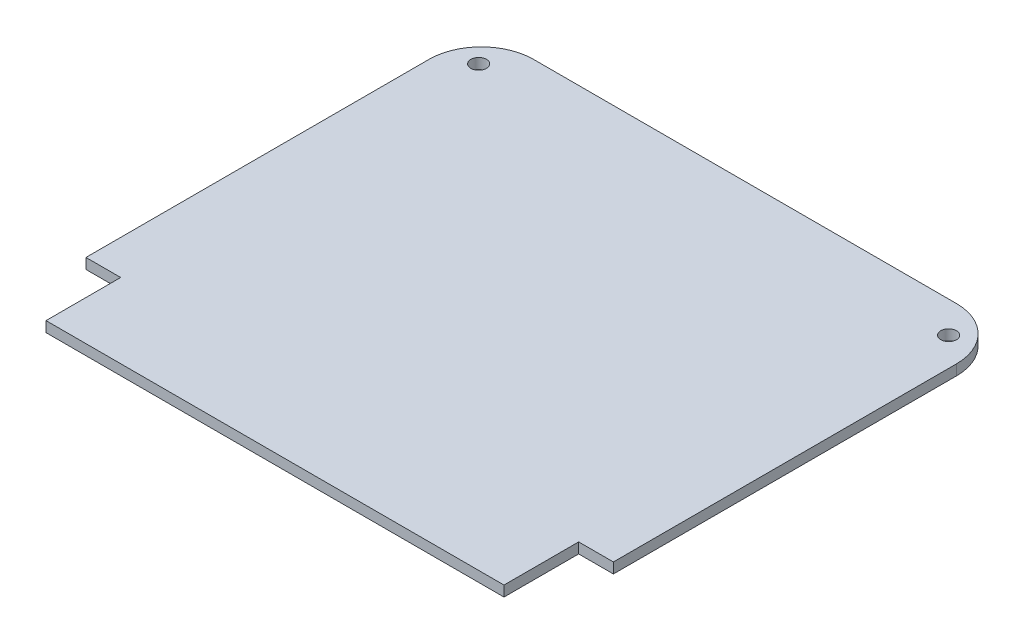
ISO-10303-21;
HEADER;
FILE_DESCRIPTION(('STEP AP214'),'2;1');
FILE_NAME('part.step','',(''),(''),'','','');
FILE_SCHEMA(('AUTOMOTIVE_DESIGN { 1 0 10303 214 1 1 1 1 }'));
ENDSEC;
DATA;
#1=APPLICATION_CONTEXT('core data for automotive mechanical design processes');
#2=APPLICATION_PROTOCOL_DEFINITION('international standard','automotive_design',2000,#1);
#3=PRODUCT_CONTEXT('',#1,'mechanical');
#4=PRODUCT('Part','Part','',(#3));
#5=PRODUCT_RELATED_PRODUCT_CATEGORY('part','',(#4));
#6=PRODUCT_DEFINITION_FORMATION('','',#4);
#7=PRODUCT_DEFINITION_CONTEXT('part definition',#1,'design');
#8=PRODUCT_DEFINITION('design','',#6,#7);
#9=PRODUCT_DEFINITION_SHAPE('','',#8);
#10=(LENGTH_UNIT() NAMED_UNIT(*) SI_UNIT(.MILLI.,.METRE.));
#11=(NAMED_UNIT(*) PLANE_ANGLE_UNIT() SI_UNIT($,.RADIAN.));
#12=(NAMED_UNIT(*) SI_UNIT($,.STERADIAN.) SOLID_ANGLE_UNIT());
#13=UNCERTAINTY_MEASURE_WITH_UNIT(LENGTH_MEASURE(1.E-05),#10,'distance_accuracy_value','');
#14=(GEOMETRIC_REPRESENTATION_CONTEXT(3) GLOBAL_UNCERTAINTY_ASSIGNED_CONTEXT((#13)) GLOBAL_UNIT_ASSIGNED_CONTEXT((#10,
#11,#12)) REPRESENTATION_CONTEXT('',''));
#15=CARTESIAN_POINT('',(0.,0.,0.));
#16=DIRECTION('',(0.,0.,1.));
#17=DIRECTION('',(1.,0.,0.));
#18=AXIS2_PLACEMENT_3D('',#15,#16,#17);
#19=CARTESIAN_POINT('',(-87.7,2.,100.302122975735));
#20=DIRECTION('',(0.,0.,-1.));
#21=DIRECTION('',(-1.,0.,0.));
#22=AXIS2_PLACEMENT_3D('',#19,#20,#21);
#23=PLANE('',#22);
#24=DIRECTION('',(1.,0.,0.));
#25=VECTOR('',#24,1.);
#26=CARTESIAN_POINT('',(-87.7,0.,100.302122975735));
#27=LINE('',#26,#25);
#28=CARTESIAN_POINT('',(-87.7,0.,100.302122975735));
#29=VERTEX_POINT('',#28);
#30=CARTESIAN_POINT('',(0.,0.,100.302122975735));
#31=VERTEX_POINT('',#30);
#32=EDGE_CURVE('E144',#29,#31,#27,.T.);
#33=ORIENTED_EDGE('',*,*,#32,.T.);
#34=DIRECTION('',(0.,-1.,0.));
#35=VECTOR('',#34,1.);
#36=CARTESIAN_POINT('',(0.,2.,100.302122975735));
#37=LINE('',#36,#35);
#38=CARTESIAN_POINT('',(0.,2.,100.302122975735));
#39=VERTEX_POINT('',#38);
#40=EDGE_CURVE('E11',#39,#31,#37,.T.);
#41=ORIENTED_EDGE('',*,*,#40,.F.);
#42=DIRECTION('',(1.,0.,0.));
#43=VECTOR('',#42,1.);
#44=CARTESIAN_POINT('',(-87.7,2.,100.302122975735));
#45=LINE('',#44,#43);
#46=CARTESIAN_POINT('',(-87.7,2.,100.302122975735));
#47=VERTEX_POINT('',#46);
#48=EDGE_CURVE('E163',#47,#39,#45,.T.);
#49=ORIENTED_EDGE('',*,*,#48,.F.);
#50=DIRECTION('',(0.,-1.,0.));
#51=VECTOR('',#50,1.);
#52=CARTESIAN_POINT('',(-87.7,2.,100.302122975735));
#53=LINE('',#52,#51);
#54=EDGE_CURVE('E140',#47,#29,#53,.T.);
#55=ORIENTED_EDGE('',*,*,#54,.T.);
#56=EDGE_LOOP('',(#33,#41,#49,#55));
#57=FACE_BOUND('',#56,.T.);
#58=ADVANCED_FACE('F34',(#57),#23,.F.);
#59=CARTESIAN_POINT('',(0.,2.,100.302122975735));
#60=DIRECTION('',(-1.,0.,0.));
#61=DIRECTION('',(0.,0.,1.));
#62=AXIS2_PLACEMENT_3D('',#59,#60,#61);
#63=PLANE('',#62);
#64=DIRECTION('',(0.,0.,-1.));
#65=VECTOR('',#64,1.);
#66=CARTESIAN_POINT('',(0.,0.,100.302122975735));
#67=LINE('',#66,#65);
#68=CARTESIAN_POINT('',(0.,0.,86.0021229757346));
#69=VERTEX_POINT('',#68);
#70=EDGE_CURVE('E147',#31,#69,#67,.T.);
#71=ORIENTED_EDGE('',*,*,#70,.T.);
#72=DIRECTION('',(0.,-1.,0.));
#73=VECTOR('',#72,1.);
#74=CARTESIAN_POINT('',(0.,2.,86.0021229757346));
#75=LINE('',#74,#73);
#76=CARTESIAN_POINT('',(0.,2.,86.0021229757346));
#77=VERTEX_POINT('',#76);
#78=EDGE_CURVE('E43',#77,#69,#75,.T.);
#79=ORIENTED_EDGE('',*,*,#78,.F.);
#80=DIRECTION('',(0.,0.,-1.));
#81=VECTOR('',#80,1.);
#82=CARTESIAN_POINT('',(0.,2.,100.302122975735));
#83=LINE('',#82,#81);
#84=EDGE_CURVE('E101',#39,#77,#83,.T.);
#85=ORIENTED_EDGE('',*,*,#84,.F.);
#86=ORIENTED_EDGE('',*,*,#40,.T.);
#87=EDGE_LOOP('',(#71,#79,#85,#86));
#88=FACE_BOUND('',#87,.T.);
#89=ADVANCED_FACE('F230',(#88),#63,.F.);
#90=CARTESIAN_POINT('',(0.,2.,86.0021229757346));
#91=DIRECTION('',(0.,0.,-1.));
#92=DIRECTION('',(-1.,0.,0.));
#93=AXIS2_PLACEMENT_3D('',#90,#91,#92);
#94=PLANE('',#93);
#95=DIRECTION('',(1.,0.,0.));
#96=VECTOR('',#95,1.);
#97=CARTESIAN_POINT('',(0.,0.,86.0021229757346));
#98=LINE('',#97,#96);
#99=CARTESIAN_POINT('',(6.64999999999999,0.,86.0021229757346));
#100=VERTEX_POINT('',#99);
#101=EDGE_CURVE('E150',#69,#100,#98,.T.);
#102=ORIENTED_EDGE('',*,*,#101,.T.);
#103=DIRECTION('',(0.,-1.,0.));
#104=VECTOR('',#103,1.);
#105=CARTESIAN_POINT('',(6.64999999999999,2.,86.0021229757346));
#106=LINE('',#105,#104);
#107=CARTESIAN_POINT('',(6.64999999999999,2.,86.0021229757346));
#108=VERTEX_POINT('',#107);
#109=EDGE_CURVE('E176',#108,#100,#106,.T.);
#110=ORIENTED_EDGE('',*,*,#109,.F.);
#111=DIRECTION('',(1.,0.,0.));
#112=VECTOR('',#111,1.);
#113=CARTESIAN_POINT('',(0.,2.,86.0021229757346));
#114=LINE('',#113,#112);
#115=EDGE_CURVE('E194',#77,#108,#114,.T.);
#116=ORIENTED_EDGE('',*,*,#115,.F.);
#117=ORIENTED_EDGE('',*,*,#78,.T.);
#118=EDGE_LOOP('',(#102,#110,#116,#117));
#119=FACE_BOUND('',#118,.T.);
#120=ADVANCED_FACE('F234',(#119),#94,.F.);
#121=CARTESIAN_POINT('',(6.64999999999999,2.,86.0021229757346));
#122=DIRECTION('',(-1.,0.,0.));
#123=DIRECTION('',(0.,0.,1.));
#124=AXIS2_PLACEMENT_3D('',#121,#122,#123);
#125=PLANE('',#124);
#126=DIRECTION('',(0.,0.,-1.));
#127=VECTOR('',#126,1.);
#128=CARTESIAN_POINT('',(6.64999999999999,0.,86.0021229757346));
#129=LINE('',#128,#127);
#130=CARTESIAN_POINT('',(6.65,0.,20.3021229757347));
#131=VERTEX_POINT('',#130);
#132=EDGE_CURVE('E152',#100,#131,#129,.T.);
#133=ORIENTED_EDGE('',*,*,#132,.T.);
#134=DIRECTION('',(0.,-1.,0.));
#135=VECTOR('',#134,1.);
#136=CARTESIAN_POINT('',(6.65,2.,20.3021229757347));
#137=LINE('',#136,#135);
#138=CARTESIAN_POINT('',(6.65,2.,20.3021229757347));
#139=VERTEX_POINT('',#138);
#140=EDGE_CURVE('E173',#139,#131,#137,.T.);
#141=ORIENTED_EDGE('',*,*,#140,.F.);
#142=DIRECTION('',(0.,0.,-1.));
#143=VECTOR('',#142,1.);
#144=CARTESIAN_POINT('',(6.64999999999999,2.,86.0021229757346));
#145=LINE('',#144,#143);
#146=EDGE_CURVE('E196',#108,#139,#145,.T.);
#147=ORIENTED_EDGE('',*,*,#146,.F.);
#148=ORIENTED_EDGE('',*,*,#109,.T.);
#149=EDGE_LOOP('',(#133,#141,#147,#148));
#150=FACE_BOUND('',#149,.T.);
#151=ADVANCED_FACE('F238',(#150),#125,.F.);
#152=CARTESIAN_POINT('',(-3.35,2.,20.3021229757346));
#153=DIRECTION('',(0.,-1.,0.));
#154=DIRECTION('',(0.,0.,-1.));
#155=AXIS2_PLACEMENT_3D('',#152,#153,#154);
#156=CYLINDRICAL_SURFACE('',#155,10.);
#157=CARTESIAN_POINT('',(-3.35,0.,20.3021229757346));
#158=DIRECTION('',(0.,1.,0.));
#159=DIRECTION('',(0.,0.,1.));
#160=AXIS2_PLACEMENT_3D('',#157,#158,#159);
#161=CIRCLE('',#160,10.);
#162=CARTESIAN_POINT('',(-3.35000000000007,0.,10.3021229757346));
#163=VERTEX_POINT('',#162);
#164=EDGE_CURVE('E154',#131,#163,#161,.T.);
#165=ORIENTED_EDGE('',*,*,#164,.T.);
#166=DIRECTION('',(0.,-1.,0.));
#167=VECTOR('',#166,1.);
#168=CARTESIAN_POINT('',(-3.35000000000007,2.,10.3021229757346));
#169=LINE('',#168,#167);
#170=CARTESIAN_POINT('',(-3.35000000000007,2.,10.3021229757346));
#171=VERTEX_POINT('',#170);
#172=EDGE_CURVE('E170',#171,#163,#169,.T.);
#173=ORIENTED_EDGE('',*,*,#172,.F.);
#174=CARTESIAN_POINT('',(-3.35,2.,20.3021229757346));
#175=DIRECTION('',(0.,1.,0.));
#176=DIRECTION('',(0.,0.,1.));
#177=AXIS2_PLACEMENT_3D('',#174,#175,#176);
#178=CIRCLE('',#177,10.);
#179=EDGE_CURVE('E198',#139,#171,#178,.T.);
#180=ORIENTED_EDGE('',*,*,#179,.F.);
#181=ORIENTED_EDGE('',*,*,#140,.T.);
#182=EDGE_LOOP('',(#165,#173,#180,#181));
#183=FACE_BOUND('',#182,.T.);
#184=ADVANCED_FACE('F244',(#183),#156,.T.);
#185=CARTESIAN_POINT('',(-3.35000000000007,2.,10.3021229757346));
#186=DIRECTION('',(0.,0.,1.));
#187=DIRECTION('',(1.,0.,0.));
#188=AXIS2_PLACEMENT_3D('',#185,#186,#187);
#189=PLANE('',#188);
#190=DIRECTION('',(-1.,0.,0.));
#191=VECTOR('',#190,1.);
#192=CARTESIAN_POINT('',(-3.35000000000007,0.,10.3021229757346));
#193=LINE('',#192,#191);
#194=CARTESIAN_POINT('',(-84.35,0.,10.3021229757346));
#195=VERTEX_POINT('',#194);
#196=EDGE_CURVE('E156',#163,#195,#193,.T.);
#197=ORIENTED_EDGE('',*,*,#196,.T.);
#198=DIRECTION('',(0.,-1.,0.));
#199=VECTOR('',#198,1.);
#200=CARTESIAN_POINT('',(-84.35,2.,10.3021229757346));
#201=LINE('',#200,#199);
#202=CARTESIAN_POINT('',(-84.35,2.,10.3021229757346));
#203=VERTEX_POINT('',#202);
#204=EDGE_CURVE('E167',#203,#195,#201,.T.);
#205=ORIENTED_EDGE('',*,*,#204,.F.);
#206=DIRECTION('',(-1.,0.,0.));
#207=VECTOR('',#206,1.);
#208=CARTESIAN_POINT('',(-3.35000000000007,2.,10.3021229757346));
#209=LINE('',#208,#207);
#210=EDGE_CURVE('E200',#171,#203,#209,.T.);
#211=ORIENTED_EDGE('',*,*,#210,.F.);
#212=ORIENTED_EDGE('',*,*,#172,.T.);
#213=EDGE_LOOP('',(#197,#205,#211,#212));
#214=FACE_BOUND('',#213,.T.);
#215=ADVANCED_FACE('F206',(#214),#189,.F.);
#216=CARTESIAN_POINT('',(-84.35,2.,20.3021229757346));
#217=DIRECTION('',(0.,-1.,0.));
#218=DIRECTION('',(0.,0.,-1.));
#219=AXIS2_PLACEMENT_3D('',#216,#217,#218);
#220=CYLINDRICAL_SURFACE('',#219,10.);
#221=CARTESIAN_POINT('',(-84.35,0.,20.3021229757346));
#222=DIRECTION('',(0.,1.,0.));
#223=DIRECTION('',(0.,0.,-1.));
#224=AXIS2_PLACEMENT_3D('',#221,#222,#223);
#225=CIRCLE('',#224,10.);
#226=CARTESIAN_POINT('',(-94.35,0.,20.3021229757347));
#227=VERTEX_POINT('',#226);
#228=EDGE_CURVE('E158',#195,#227,#225,.T.);
#229=ORIENTED_EDGE('',*,*,#228,.T.);
#230=DIRECTION('',(0.,-1.,0.));
#231=VECTOR('',#230,1.);
#232=CARTESIAN_POINT('',(-94.35,2.,20.3021229757347));
#233=LINE('',#232,#231);
#234=CARTESIAN_POINT('',(-94.35,2.,20.3021229757347));
#235=VERTEX_POINT('',#234);
#236=EDGE_CURVE('E135',#235,#227,#233,.T.);
#237=ORIENTED_EDGE('',*,*,#236,.F.);
#238=CARTESIAN_POINT('',(-84.35,2.,20.3021229757346));
#239=DIRECTION('',(0.,1.,0.));
#240=DIRECTION('',(0.,0.,-1.));
#241=AXIS2_PLACEMENT_3D('',#238,#239,#240);
#242=CIRCLE('',#241,10.);
#243=EDGE_CURVE('E126',#203,#235,#242,.T.);
#244=ORIENTED_EDGE('',*,*,#243,.F.);
#245=ORIENTED_EDGE('',*,*,#204,.T.);
#246=EDGE_LOOP('',(#229,#237,#244,#245));
#247=FACE_BOUND('',#246,.T.);
#248=ADVANCED_FACE('F210',(#247),#220,.T.);
#249=CARTESIAN_POINT('',(-94.35,2.,20.3021229757347));
#250=DIRECTION('',(1.,0.,0.));
#251=DIRECTION('',(0.,0.,-1.));
#252=AXIS2_PLACEMENT_3D('',#249,#250,#251);
#253=PLANE('',#252);
#254=DIRECTION('',(0.,0.,1.));
#255=VECTOR('',#254,1.);
#256=CARTESIAN_POINT('',(-94.35,0.,20.3021229757347));
#257=LINE('',#256,#255);
#258=CARTESIAN_POINT('',(-94.35,0.,86.0021229757346));
#259=VERTEX_POINT('',#258);
#260=EDGE_CURVE('E134',#227,#259,#257,.T.);
#261=ORIENTED_EDGE('',*,*,#260,.T.);
#262=DIRECTION('',(0.,-1.,0.));
#263=VECTOR('',#262,1.);
#264=CARTESIAN_POINT('',(-94.35,2.,86.0021229757346));
#265=LINE('',#264,#263);
#266=CARTESIAN_POINT('',(-94.35,2.,86.0021229757346));
#267=VERTEX_POINT('',#266);
#268=EDGE_CURVE('E131',#267,#259,#265,.T.);
#269=ORIENTED_EDGE('',*,*,#268,.F.);
#270=DIRECTION('',(0.,0.,1.));
#271=VECTOR('',#270,1.);
#272=CARTESIAN_POINT('',(-94.35,2.,20.3021229757347));
#273=LINE('',#272,#271);
#274=EDGE_CURVE('E120',#235,#267,#273,.T.);
#275=ORIENTED_EDGE('',*,*,#274,.F.);
#276=ORIENTED_EDGE('',*,*,#236,.T.);
#277=EDGE_LOOP('',(#261,#269,#275,#276));
#278=FACE_BOUND('',#277,.T.);
#279=ADVANCED_FACE('F132',(#278),#253,.F.);
#280=CARTESIAN_POINT('',(-94.35,2.,86.0021229757346));
#281=DIRECTION('',(0.,0.,-1.));
#282=DIRECTION('',(-1.,0.,0.));
#283=AXIS2_PLACEMENT_3D('',#280,#281,#282);
#284=PLANE('',#283);
#285=DIRECTION('',(1.,0.,0.));
#286=VECTOR('',#285,1.);
#287=CARTESIAN_POINT('',(-94.35,0.,86.0021229757346));
#288=LINE('',#287,#286);
#289=CARTESIAN_POINT('',(-87.7,0.,86.0021229757346));
#290=VERTEX_POINT('',#289);
#291=EDGE_CURVE('E87',#259,#290,#288,.T.);
#292=ORIENTED_EDGE('',*,*,#291,.T.);
#293=DIRECTION('',(0.,-1.,0.));
#294=VECTOR('',#293,1.);
#295=CARTESIAN_POINT('',(-87.7,2.,86.0021229757346));
#296=LINE('',#295,#294);
#297=CARTESIAN_POINT('',(-87.7,2.,86.0021229757346));
#298=VERTEX_POINT('',#297);
#299=EDGE_CURVE('E136',#298,#290,#296,.T.);
#300=ORIENTED_EDGE('',*,*,#299,.F.);
#301=DIRECTION('',(1.,0.,0.));
#302=VECTOR('',#301,1.);
#303=CARTESIAN_POINT('',(-94.35,2.,86.0021229757346));
#304=LINE('',#303,#302);
#305=EDGE_CURVE('E124',#267,#298,#304,.T.);
#306=ORIENTED_EDGE('',*,*,#305,.F.);
#307=ORIENTED_EDGE('',*,*,#268,.T.);
#308=EDGE_LOOP('',(#292,#300,#306,#307));
#309=FACE_BOUND('',#308,.T.);
#310=ADVANCED_FACE('F138',(#309),#284,.F.);
#311=CARTESIAN_POINT('',(-87.7,2.,86.0021229757346));
#312=DIRECTION('',(1.,0.,0.));
#313=DIRECTION('',(0.,0.,-1.));
#314=AXIS2_PLACEMENT_3D('',#311,#312,#313);
#315=PLANE('',#314);
#316=DIRECTION('',(0.,0.,1.));
#317=VECTOR('',#316,1.);
#318=CARTESIAN_POINT('',(-87.7,0.,86.0021229757346));
#319=LINE('',#318,#317);
#320=EDGE_CURVE('E93',#290,#29,#319,.T.);
#321=ORIENTED_EDGE('',*,*,#320,.T.);
#322=ORIENTED_EDGE('',*,*,#54,.F.);
#323=DIRECTION('',(0.,0.,1.));
#324=VECTOR('',#323,1.);
#325=CARTESIAN_POINT('',(-87.7,2.,86.0021229757346));
#326=LINE('',#325,#324);
#327=EDGE_CURVE('E52',#298,#47,#326,.T.);
#328=ORIENTED_EDGE('',*,*,#327,.F.);
#329=ORIENTED_EDGE('',*,*,#299,.T.);
#330=EDGE_LOOP('',(#321,#322,#328,#329));
#331=FACE_BOUND('',#330,.T.);
#332=ADVANCED_FACE('F218',(#331),#315,.F.);
#333=CARTESIAN_POINT('',(-3.35,2.,20.3021229757346));
#334=DIRECTION('',(0.,1.,0.));
#335=DIRECTION('',(0.,0.,1.));
#336=AXIS2_PLACEMENT_3D('',#333,#334,#335);
#337=PLANE('',#336);
#338=CARTESIAN_POINT('',(1.15,2.,16.3021229757346));
#339=DIRECTION('',(0.,1.,0.));
#340=DIRECTION('',(0.,0.,-1.));
#341=AXIS2_PLACEMENT_3D('',#338,#339,#340);
#342=CIRCLE('',#341,1.49999999999998);
#343=CARTESIAN_POINT('',(1.15,2.,14.8021229757346));
#344=VERTEX_POINT('',#343);
#345=EDGE_CURVE('E189',#344,#344,#342,.T.);
#346=ORIENTED_EDGE('',*,*,#345,.F.);
#347=EDGE_LOOP('',(#346));
#348=FACE_BOUND('',#347,.T.);
#349=CARTESIAN_POINT('',(-88.85,2.,16.3021229757346));
#350=DIRECTION('',(0.,1.,0.));
#351=DIRECTION('',(0.,0.,1.));
#352=AXIS2_PLACEMENT_3D('',#349,#350,#351);
#353=CIRCLE('',#352,1.5);
#354=CARTESIAN_POINT('',(-88.85,2.,17.8021229757346));
#355=VERTEX_POINT('',#354);
#356=EDGE_CURVE('E181',#355,#355,#353,.T.);
#357=ORIENTED_EDGE('',*,*,#356,.F.);
#358=EDGE_LOOP('',(#357));
#359=FACE_BOUND('',#358,.T.);
#360=ORIENTED_EDGE('',*,*,#48,.T.);
#361=ORIENTED_EDGE('',*,*,#84,.T.);
#362=ORIENTED_EDGE('',*,*,#115,.T.);
#363=ORIENTED_EDGE('',*,*,#146,.T.);
#364=ORIENTED_EDGE('',*,*,#179,.T.);
#365=ORIENTED_EDGE('',*,*,#210,.T.);
#366=ORIENTED_EDGE('',*,*,#243,.T.);
#367=ORIENTED_EDGE('',*,*,#274,.T.);
#368=ORIENTED_EDGE('',*,*,#305,.T.);
#369=ORIENTED_EDGE('',*,*,#327,.T.);
#370=EDGE_LOOP('',(#360,#361,#362,#363,#364,#365,#366,#367,#368,#369));
#371=FACE_BOUND('',#370,.T.);
#372=ADVANCED_FACE('F122',(#348,#359,#371),#337,.T.);
#373=CARTESIAN_POINT('',(-3.35,0.,20.3021229757346));
#374=DIRECTION('',(0.,1.,0.));
#375=DIRECTION('',(0.,0.,1.));
#376=AXIS2_PLACEMENT_3D('',#373,#374,#375);
#377=PLANE('',#376);
#378=CARTESIAN_POINT('',(1.15,0.,16.3021229757346));
#379=DIRECTION('',(0.,1.,0.));
#380=DIRECTION('',(0.,0.,1.));
#381=AXIS2_PLACEMENT_3D('',#378,#379,#380);
#382=CIRCLE('',#381,1.49999999999998);
#383=CARTESIAN_POINT('',(1.15,0.,17.8021229757346));
#384=VERTEX_POINT('',#383);
#385=EDGE_CURVE('E37',#384,#384,#382,.T.);
#386=ORIENTED_EDGE('',*,*,#385,.T.);
#387=EDGE_LOOP('',(#386));
#388=FACE_BOUND('',#387,.T.);
#389=CARTESIAN_POINT('',(-88.85,0.,16.3021229757346));
#390=DIRECTION('',(0.,1.,0.));
#391=DIRECTION('',(0.,0.,1.));
#392=AXIS2_PLACEMENT_3D('',#389,#390,#391);
#393=CIRCLE('',#392,1.5);
#394=CARTESIAN_POINT('',(-88.85,0.,17.8021229757346));
#395=VERTEX_POINT('',#394);
#396=EDGE_CURVE('E148',#395,#395,#393,.T.);
#397=ORIENTED_EDGE('',*,*,#396,.T.);
#398=EDGE_LOOP('',(#397));
#399=FACE_BOUND('',#398,.T.);
#400=ORIENTED_EDGE('',*,*,#32,.F.);
#401=ORIENTED_EDGE('',*,*,#320,.F.);
#402=ORIENTED_EDGE('',*,*,#291,.F.);
#403=ORIENTED_EDGE('',*,*,#260,.F.);
#404=ORIENTED_EDGE('',*,*,#228,.F.);
#405=ORIENTED_EDGE('',*,*,#196,.F.);
#406=ORIENTED_EDGE('',*,*,#164,.F.);
#407=ORIENTED_EDGE('',*,*,#132,.F.);
#408=ORIENTED_EDGE('',*,*,#101,.F.);
#409=ORIENTED_EDGE('',*,*,#70,.F.);
#410=EDGE_LOOP('',(#400,#401,#402,#403,#404,#405,#406,#407,#408,#409));
#411=FACE_BOUND('',#410,.T.);
#412=ADVANCED_FACE('F213',(#388,#399,#411),#377,.F.);
#413=CARTESIAN_POINT('',(-88.85,-8.,16.3021229757346));
#414=DIRECTION('',(0.,1.,0.));
#415=DIRECTION('',(0.,0.,1.));
#416=AXIS2_PLACEMENT_3D('',#413,#414,#415);
#417=CYLINDRICAL_SURFACE('',#416,1.5);
#418=ORIENTED_EDGE('',*,*,#356,.T.);
#419=EDGE_LOOP('',(#418));
#420=FACE_BOUND('',#419,.T.);
#421=ORIENTED_EDGE('',*,*,#396,.F.);
#422=EDGE_LOOP('',(#421));
#423=FACE_BOUND('',#422,.T.);
#424=ADVANCED_FACE('F281',(#420,#423),#417,.F.);
#425=CARTESIAN_POINT('',(1.15,-8.,16.3021229757346));
#426=DIRECTION('',(0.,1.,0.));
#427=DIRECTION('',(0.,0.,1.));
#428=AXIS2_PLACEMENT_3D('',#425,#426,#427);
#429=CYLINDRICAL_SURFACE('',#428,1.49999999999998);
#430=ORIENTED_EDGE('',*,*,#345,.T.);
#431=EDGE_LOOP('',(#430));
#432=FACE_BOUND('',#431,.T.);
#433=ORIENTED_EDGE('',*,*,#385,.F.);
#434=EDGE_LOOP('',(#433));
#435=FACE_BOUND('',#434,.T.);
#436=ADVANCED_FACE('F290',(#432,#435),#429,.F.);
#437=CLOSED_SHELL('',(#58,#89,#120,#151,#184,#215,#248,#279,#310,#332,#372,#412,#424,#436));
#438=MANIFOLD_SOLID_BREP('B2',#437);
#439=ADVANCED_BREP_SHAPE_REPRESENTATION('',(#18,#438),#14);
#440=SHAPE_DEFINITION_REPRESENTATION(#9,#439);
ENDSEC;
END-ISO-10303-21;
